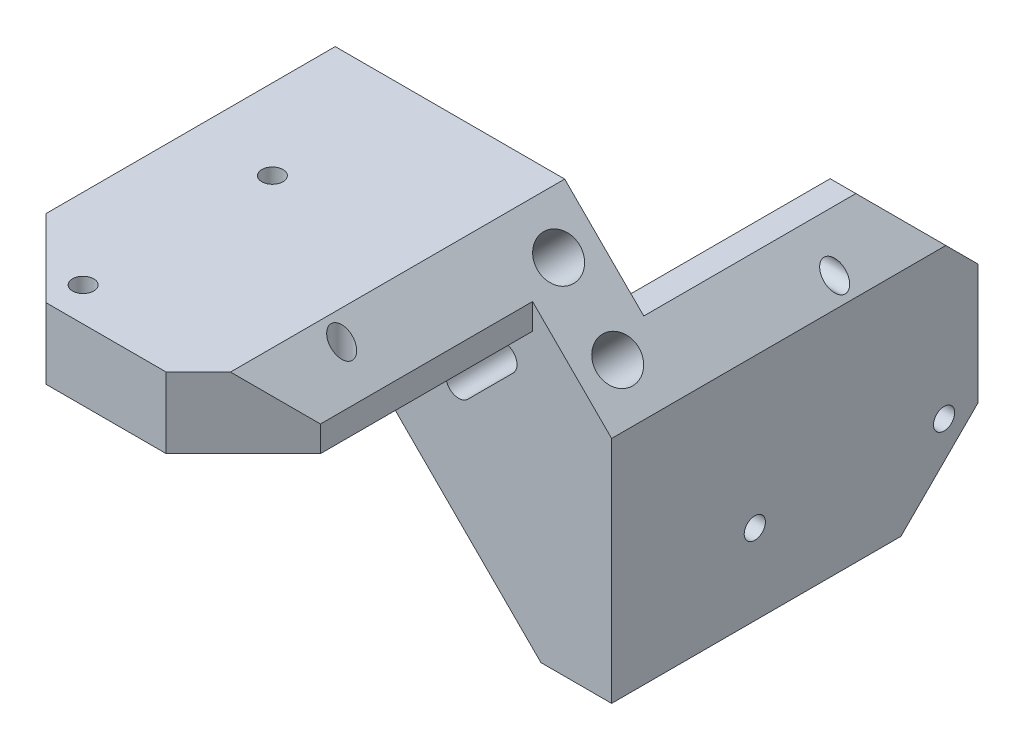
ISO-10303-21;
HEADER;
FILE_DESCRIPTION(('STEP AP214'),'2;1');
FILE_NAME('part.step','',(''),(''),'','','');
FILE_SCHEMA(('AUTOMOTIVE_DESIGN { 1 0 10303 214 1 1 1 1 }'));
ENDSEC;
DATA;
#1=APPLICATION_CONTEXT('core data for automotive mechanical design processes');
#2=APPLICATION_PROTOCOL_DEFINITION('international standard','automotive_design',2000,#1);
#3=PRODUCT_CONTEXT('',#1,'mechanical');
#4=PRODUCT('Part','Part','',(#3));
#5=PRODUCT_RELATED_PRODUCT_CATEGORY('part','',(#4));
#6=PRODUCT_DEFINITION_FORMATION('','',#4);
#7=PRODUCT_DEFINITION_CONTEXT('part definition',#1,'design');
#8=PRODUCT_DEFINITION('design','',#6,#7);
#9=PRODUCT_DEFINITION_SHAPE('','',#8);
#10=(LENGTH_UNIT() NAMED_UNIT(*) SI_UNIT(.MILLI.,.METRE.));
#11=(NAMED_UNIT(*) PLANE_ANGLE_UNIT() SI_UNIT($,.RADIAN.));
#12=(NAMED_UNIT(*) SI_UNIT($,.STERADIAN.) SOLID_ANGLE_UNIT());
#13=UNCERTAINTY_MEASURE_WITH_UNIT(LENGTH_MEASURE(1.E-05),#10,'distance_accuracy_value','');
#14=(GEOMETRIC_REPRESENTATION_CONTEXT(3) GLOBAL_UNCERTAINTY_ASSIGNED_CONTEXT((#13)) GLOBAL_UNIT_ASSIGNED_CONTEXT((#10,
#11,#12)) REPRESENTATION_CONTEXT('',''));
#15=CARTESIAN_POINT('',(0.,0.,0.));
#16=DIRECTION('',(0.,0.,1.));
#17=DIRECTION('',(1.,0.,0.));
#18=AXIS2_PLACEMENT_3D('',#15,#16,#17);
#19=CARTESIAN_POINT('',(27.5,-27.5,51.));
#20=DIRECTION('',(-1.,0.,0.));
#21=DIRECTION('',(0.,0.,1.));
#22=AXIS2_PLACEMENT_3D('',#19,#20,#21);
#23=PLANE('',#22);
#24=CARTESIAN_POINT('',(27.5,-15.0000000000001,-45.7224318643354));
#25=DIRECTION('',(-1.,0.,0.));
#26=DIRECTION('',(0.,0.,1.));
#27=AXIS2_PLACEMENT_3D('',#24,#25,#26);
#28=CIRCLE('',#27,1.65);
#29=CARTESIAN_POINT('',(27.5,-15.0000000000001,-44.0724318643354));
#30=VERTEX_POINT('',#29);
#31=EDGE_CURVE('E283',#30,#30,#28,.T.);
#32=ORIENTED_EDGE('',*,*,#31,.T.);
#33=EDGE_LOOP('',(#32));
#34=FACE_BOUND('',#33,.T.);
#35=CARTESIAN_POINT('',(27.5,-15.0000000000001,-16.2775681356646));
#36=DIRECTION('',(-1.,0.,0.));
#37=DIRECTION('',(0.,0.,1.));
#38=AXIS2_PLACEMENT_3D('',#35,#36,#37);
#39=CIRCLE('',#38,1.65);
#40=CARTESIAN_POINT('',(27.5,-15.0000000000001,-14.6275681356646));
#41=VERTEX_POINT('',#40);
#42=EDGE_CURVE('E289',#41,#41,#39,.T.);
#43=ORIENTED_EDGE('',*,*,#42,.T.);
#44=EDGE_LOOP('',(#43));
#45=FACE_BOUND('',#44,.T.);
#46=DIRECTION('',(0.,0.,-1.));
#47=VECTOR('',#46,1.);
#48=CARTESIAN_POINT('',(27.5,-27.5,51.));
#49=LINE('',#48,#47);
#50=CARTESIAN_POINT('',(27.5,-27.5,6.));
#51=VERTEX_POINT('',#50);
#52=CARTESIAN_POINT('',(27.5,-27.5,-39.));
#53=VERTEX_POINT('',#52);
#54=EDGE_CURVE('E331',#51,#53,#49,.T.);
#55=ORIENTED_EDGE('',*,*,#54,.T.);
#56=DIRECTION('',(0.,0.707106781186548,-0.707106781186547));
#57=VECTOR('',#56,1.);
#58=CARTESIAN_POINT('',(27.5,-27.5,-39.));
#59=LINE('',#58,#57);
#60=CARTESIAN_POINT('',(27.5,-15.5,-51.));
#61=VERTEX_POINT('',#60);
#62=EDGE_CURVE('E353',#53,#61,#59,.T.);
#63=ORIENTED_EDGE('',*,*,#62,.T.);
#64=DIRECTION('',(0.,1.,0.));
#65=VECTOR('',#64,1.);
#66=CARTESIAN_POINT('',(27.5,-27.5,-51.));
#67=LINE('',#66,#65);
#68=CARTESIAN_POINT('',(27.5,3.19999999999998,-51.));
#69=VERTEX_POINT('',#68);
#70=EDGE_CURVE('E325',#61,#69,#67,.T.);
#71=ORIENTED_EDGE('',*,*,#70,.T.);
#72=DIRECTION('',(0.,0.707106781186551,0.707106781186543));
#73=VECTOR('',#72,1.);
#74=CARTESIAN_POINT('',(27.5,3.19999999999998,-51.));
#75=LINE('',#74,#73);
#76=CARTESIAN_POINT('',(27.5,8.19999999999995,-46.0000000000001));
#77=VERTEX_POINT('',#76);
#78=EDGE_CURVE('E198',#69,#77,#75,.T.);
#79=ORIENTED_EDGE('',*,*,#78,.T.);
#80=DIRECTION('',(0.,0.,1.));
#81=VECTOR('',#80,1.);
#82=CARTESIAN_POINT('',(27.5,8.19999999999995,51.));
#83=LINE('',#82,#81);
#84=CARTESIAN_POINT('',(27.5,8.19999999999995,6.));
#85=VERTEX_POINT('',#84);
#86=EDGE_CURVE('E339',#77,#85,#83,.T.);
#87=ORIENTED_EDGE('',*,*,#86,.T.);
#88=DIRECTION('',(0.,1.,0.));
#89=VECTOR('',#88,1.);
#90=CARTESIAN_POINT('',(27.5,-27.5,6.));
#91=LINE('',#90,#89);
#92=EDGE_CURVE('E295',#51,#85,#91,.T.);
#93=ORIENTED_EDGE('',*,*,#92,.F.);
#94=EDGE_LOOP('',(#55,#63,#71,#79,#87,#93));
#95=FACE_BOUND('',#94,.T.);
#96=ADVANCED_FACE('F39',(#34,#45,#95),#23,.F.);
#97=CARTESIAN_POINT('',(-27.5,-27.5,51.));
#98=DIRECTION('',(0.,1.,0.));
#99=DIRECTION('',(0.,0.,1.));
#100=AXIS2_PLACEMENT_3D('',#97,#98,#99);
#101=PLANE('',#100);
#102=DIRECTION('',(0.,0.,1.));
#103=VECTOR('',#102,1.);
#104=CARTESIAN_POINT('',(16.5,-27.5,-51.));
#105=LINE('',#104,#103);
#106=CARTESIAN_POINT('',(16.5,-27.5,-39.));
#107=VERTEX_POINT('',#106);
#108=CARTESIAN_POINT('',(16.5,-27.5,-6.00000000000001));
#109=VERTEX_POINT('',#108);
#110=EDGE_CURVE('E326',#107,#109,#105,.T.);
#111=ORIENTED_EDGE('',*,*,#110,.F.);
#112=DIRECTION('',(1.,0.,0.));
#113=VECTOR('',#112,1.);
#114=CARTESIAN_POINT('',(27.5,-27.5,-39.));
#115=LINE('',#114,#113);
#116=EDGE_CURVE('E346',#107,#53,#115,.T.);
#117=ORIENTED_EDGE('',*,*,#116,.T.);
#118=ORIENTED_EDGE('',*,*,#54,.F.);
#119=DIRECTION('',(1.,0.,0.));
#120=VECTOR('',#119,1.);
#121=CARTESIAN_POINT('',(-27.5,-27.5,6.));
#122=LINE('',#121,#120);
#123=CARTESIAN_POINT('',(16.5,-27.5,6.));
#124=VERTEX_POINT('',#123);
#125=EDGE_CURVE('E293',#124,#51,#122,.T.);
#126=ORIENTED_EDGE('',*,*,#125,.F.);
#127=EDGE_CURVE('E321',#109,#124,#105,.T.);
#128=ORIENTED_EDGE('',*,*,#127,.F.);
#129=EDGE_LOOP('',(#111,#117,#118,#126,#128));
#130=FACE_BOUND('',#129,.T.);
#131=ADVANCED_FACE('F391',(#130),#101,.F.);
#132=CARTESIAN_POINT('',(0.,0.,51.));
#133=DIRECTION('',(0.,0.,-1.));
#134=DIRECTION('',(-1.,0.,0.));
#135=AXIS2_PLACEMENT_3D('',#132,#133,#134);
#136=PLANE('',#135);
#137=DIRECTION('',(-1.,0.,0.));
#138=VECTOR('',#137,1.);
#139=CARTESIAN_POINT('',(-27.5,27.5,51.));
#140=LINE('',#139,#138);
#141=CARTESIAN_POINT('',(3.19999999999997,27.5,51.));
#142=VERTEX_POINT('',#141);
#143=CARTESIAN_POINT('',(-15.5,27.5,51.));
#144=VERTEX_POINT('',#143);
#145=EDGE_CURVE('E328',#142,#144,#140,.T.);
#146=ORIENTED_EDGE('',*,*,#145,.T.);
#147=DIRECTION('',(0.,-1.,0.));
#148=VECTOR('',#147,1.);
#149=CARTESIAN_POINT('',(-15.5,0.,51.));
#150=LINE('',#149,#148);
#151=CARTESIAN_POINT('',(-15.5,16.5,51.));
#152=VERTEX_POINT('',#151);
#153=EDGE_CURVE('E359',#144,#152,#150,.T.);
#154=ORIENTED_EDGE('',*,*,#153,.T.);
#155=DIRECTION('',(-1.,0.,0.));
#156=VECTOR('',#155,1.);
#157=CARTESIAN_POINT('',(-27.5,16.5,51.));
#158=LINE('',#157,#156);
#159=CARTESIAN_POINT('',(3.19999999999997,16.5,51.));
#160=VERTEX_POINT('',#159);
#161=EDGE_CURVE('E296',#160,#152,#158,.T.);
#162=ORIENTED_EDGE('',*,*,#161,.F.);
#163=DIRECTION('',(0.,-1.,0.));
#164=VECTOR('',#163,1.);
#165=CARTESIAN_POINT('',(3.19999999999997,27.5,51.));
#166=LINE('',#165,#164);
#167=EDGE_CURVE('E229',#142,#160,#166,.T.);
#168=ORIENTED_EDGE('',*,*,#167,.F.);
#169=EDGE_LOOP('',(#146,#154,#162,#168));
#170=FACE_BOUND('',#169,.T.);
#171=ADVANCED_FACE('F397',(#170),#136,.F.);
#172=CARTESIAN_POINT('',(-27.5,16.5,-51.));
#173=DIRECTION('',(0.707106781186548,0.707106781186548,0.));
#174=DIRECTION('',(-0.707106781186548,0.707106781186548,0.));
#175=AXIS2_PLACEMENT_3D('',#172,#173,#174);
#176=PLANE('',#175);
#177=CARTESIAN_POINT('',(-10.0961940777126,-0.903805922287441,0.));
#178=DIRECTION('',(-0.707106781186548,-0.707106781186547,0.));
#179=DIRECTION('',(0.707106781186547,-0.707106781186548,0.));
#180=AXIS2_PLACEMENT_3D('',#177,#178,#179);
#181=CIRCLE('',#180,5.49999999999999);
#182=CARTESIAN_POINT('',(-6.20710678118655,-4.79289321881345,0.));
#183=VERTEX_POINT('',#182);
#184=EDGE_CURVE('E236',#183,#183,#181,.T.);
#185=ORIENTED_EDGE('',*,*,#184,.F.);
#186=EDGE_LOOP('',(#185));
#187=FACE_BOUND('',#186,.T.);
#188=CARTESIAN_POINT('',(-0.903805922287443,-10.0961940777126,0.));
#189=DIRECTION('',(-0.707106781186548,-0.707106781186547,0.));
#190=DIRECTION('',(0.707106781186547,-0.707106781186548,0.));
#191=AXIS2_PLACEMENT_3D('',#188,#189,#190);
#192=CIRCLE('',#191,5.49999999999999);
#193=CARTESIAN_POINT('',(2.98528137423856,-13.9852813742386,0.));
#194=VERTEX_POINT('',#193);
#195=EDGE_CURVE('E246',#194,#194,#192,.T.);
#196=ORIENTED_EDGE('',*,*,#195,.F.);
#197=EDGE_LOOP('',(#196));
#198=FACE_BOUND('',#197,.T.);
#199=DIRECTION('',(0.707106781186548,-0.707106781186548,0.));
#200=VECTOR('',#199,1.);
#201=CARTESIAN_POINT('',(-27.5,16.5,6.));
#202=LINE('',#201,#200);
#203=CARTESIAN_POINT('',(-27.5,16.5,6.));
#204=VERTEX_POINT('',#203);
#205=EDGE_CURVE('E305',#204,#124,#202,.T.);
#206=ORIENTED_EDGE('',*,*,#205,.F.);
#207=DIRECTION('',(0.,0.,1.));
#208=VECTOR('',#207,1.);
#209=CARTESIAN_POINT('',(-27.5,16.5,-51.));
#210=LINE('',#209,#208);
#211=CARTESIAN_POINT('',(-27.5,16.5,-6.));
#212=VERTEX_POINT('',#211);
#213=EDGE_CURVE('E322',#212,#204,#210,.T.);
#214=ORIENTED_EDGE('',*,*,#213,.F.);
#215=DIRECTION('',(0.707106781186548,-0.707106781186548,0.));
#216=VECTOR('',#215,1.);
#217=CARTESIAN_POINT('',(-27.5,16.5,-6.));
#218=LINE('',#217,#216);
#219=EDGE_CURVE('E318',#212,#109,#218,.T.);
#220=ORIENTED_EDGE('',*,*,#219,.T.);
#221=ORIENTED_EDGE('',*,*,#127,.T.);
#222=EDGE_LOOP('',(#206,#214,#220,#221));
#223=FACE_BOUND('',#222,.T.);
#224=ADVANCED_FACE('F407',(#187,#198,#223),#176,.F.);
#225=CARTESIAN_POINT('',(8.20000000000001,27.5,51.));
#226=DIRECTION('',(-0.707106781186548,-0.707106781186546,0.));
#227=DIRECTION('',(0.,0.,-1.));
#228=AXIS2_PLACEMENT_3D('',#225,#226,#227);
#229=PLANE('',#228);
#230=DIRECTION('',(0.,0.,1.));
#231=VECTOR('',#230,1.);
#232=CARTESIAN_POINT('',(20.5,15.2,51.));
#233=LINE('',#232,#231);
#234=CARTESIAN_POINT('',(20.5,15.2,-6.));
#235=VERTEX_POINT('',#234);
#236=CARTESIAN_POINT('',(20.5,15.2,-39.0000000000001));
#237=VERTEX_POINT('',#236);
#238=EDGE_CURVE('E215',#235,#237,#233,.F.);
#239=ORIENTED_EDGE('',*,*,#238,.F.);
#240=DIRECTION('',(-0.707106781186547,0.707106781186549,0.));
#241=VECTOR('',#240,1.);
#242=CARTESIAN_POINT('',(8.2,27.5,-6.));
#243=LINE('',#242,#241);
#244=CARTESIAN_POINT('',(8.2,27.5,-6.));
#245=VERTEX_POINT('',#244);
#246=EDGE_CURVE('E341',#245,#235,#243,.F.);
#247=ORIENTED_EDGE('',*,*,#246,.F.);
#248=DIRECTION('',(0.,0.,-1.));
#249=VECTOR('',#248,1.);
#250=CARTESIAN_POINT('',(8.20000000000001,27.5,51.));
#251=LINE('',#250,#249);
#252=CARTESIAN_POINT('',(8.2,27.5,46.));
#253=VERTEX_POINT('',#252);
#254=EDGE_CURVE('E337',#253,#245,#251,.T.);
#255=ORIENTED_EDGE('',*,*,#254,.F.);
#256=DIRECTION('',(0.577350269189625,-0.577350269189626,-0.577350269189627));
#257=VECTOR('',#256,1.);
#258=CARTESIAN_POINT('',(6.53333333333332,29.1666666666667,47.6666666666666));
#259=LINE('',#258,#257);
#260=CARTESIAN_POINT('',(15.2,20.5,39.));
#261=VERTEX_POINT('',#260);
#262=EDGE_CURVE('E228',#261,#253,#259,.F.);
#263=ORIENTED_EDGE('',*,*,#262,.F.);
#264=DIRECTION('',(0.,0.,-1.));
#265=VECTOR('',#264,1.);
#266=CARTESIAN_POINT('',(15.2,20.5,51.));
#267=LINE('',#266,#265);
#268=CARTESIAN_POINT('',(15.2,20.5,6.));
#269=VERTEX_POINT('',#268);
#270=EDGE_CURVE('E234',#269,#261,#267,.F.);
#271=ORIENTED_EDGE('',*,*,#270,.F.);
#272=DIRECTION('',(-0.707106781186547,0.707106781186549,0.));
#273=VECTOR('',#272,1.);
#274=CARTESIAN_POINT('',(8.20000000000001,27.5,6.));
#275=LINE('',#274,#273);
#276=EDGE_CURVE('E343',#269,#85,#275,.F.);
#277=ORIENTED_EDGE('',*,*,#276,.T.);
#278=ORIENTED_EDGE('',*,*,#86,.F.);
#279=DIRECTION('',(-0.577350269189627,0.577350269189628,0.577350269189622));
#280=VECTOR('',#279,1.);
#281=CARTESIAN_POINT('',(-17.7,53.4,-0.800000000000495));
#282=LINE('',#281,#280);
#283=EDGE_CURVE('E209',#237,#77,#282,.F.);
#284=ORIENTED_EDGE('',*,*,#283,.F.);
#285=EDGE_LOOP('',(#239,#247,#255,#263,#271,#277,#278,#284));
#286=FACE_BOUND('',#285,.T.);
#287=CARTESIAN_POINT('',(13.2538059222874,22.4461940777126,0.));
#288=DIRECTION('',(-0.707106781186548,-0.707106781186546,0.));
#289=DIRECTION('',(0.707106781186547,-0.707106781186549,0.));
#290=AXIS2_PLACEMENT_3D('',#287,#288,#289);
#291=CIRCLE('',#290,3.29999999999999);
#292=CARTESIAN_POINT('',(15.587258300203,20.1127416997969,0.));
#293=VERTEX_POINT('',#292);
#294=EDGE_CURVE('E245',#293,#293,#291,.F.);
#295=ORIENTED_EDGE('',*,*,#294,.F.);
#296=EDGE_LOOP('',(#295));
#297=FACE_BOUND('',#296,.T.);
#298=CARTESIAN_POINT('',(22.4461940777125,13.2538059222874,0.));
#299=DIRECTION('',(-0.707106781186548,-0.707106781186546,0.));
#300=DIRECTION('',(0.707106781186547,-0.707106781186549,0.));
#301=AXIS2_PLACEMENT_3D('',#298,#299,#300);
#302=CIRCLE('',#301,3.29999999999999);
#303=CARTESIAN_POINT('',(24.7796464556281,10.9203535443718,0.));
#304=VERTEX_POINT('',#303);
#305=EDGE_CURVE('E255',#304,#304,#302,.F.);
#306=ORIENTED_EDGE('',*,*,#305,.F.);
#307=EDGE_LOOP('',(#306));
#308=FACE_BOUND('',#307,.T.);
#309=CARTESIAN_POINT('',(10.5,25.2,31.));
#310=DIRECTION('',(-0.707106781186548,-0.707106781186546,0.));
#311=DIRECTION('',(0.707106781186547,-0.707106781186549,0.));
#312=AXIS2_PLACEMENT_3D('',#309,#310,#311);
#313=ELLIPSE('',#312,2.3334523779156,1.64999999999999);
#314=CARTESIAN_POINT('',(12.15,23.55,31.));
#315=VERTEX_POINT('',#314);
#316=EDGE_CURVE('E259',#315,#315,#313,.F.);
#317=ORIENTED_EDGE('',*,*,#316,.F.);
#318=EDGE_LOOP('',(#317));
#319=FACE_BOUND('',#318,.T.);
#320=CARTESIAN_POINT('',(25.2,10.5,-31.));
#321=DIRECTION('',(-0.707106781186548,-0.707106781186546,0.));
#322=DIRECTION('',(-0.707106781186547,0.707106781186549,0.));
#323=AXIS2_PLACEMENT_3D('',#320,#321,#322);
#324=ELLIPSE('',#323,2.33345237791559,1.64999999999999);
#325=CARTESIAN_POINT('',(23.55,12.15,-31.));
#326=VERTEX_POINT('',#325);
#327=EDGE_CURVE('E277',#326,#326,#324,.F.);
#328=ORIENTED_EDGE('',*,*,#327,.F.);
#329=EDGE_LOOP('',(#328));
#330=FACE_BOUND('',#329,.T.);
#331=ADVANCED_FACE('F405',(#286,#297,#308,#319,#330),#229,.F.);
#332=CARTESIAN_POINT('',(-27.5,27.5,51.));
#333=DIRECTION('',(0.,-1.,0.));
#334=DIRECTION('',(0.,0.,-1.));
#335=AXIS2_PLACEMENT_3D('',#332,#333,#334);
#336=PLANE('',#335);
#337=CARTESIAN_POINT('',(-15.0000000000001,27.5,45.7224318643354));
#338=DIRECTION('',(0.,-1.,0.));
#339=DIRECTION('',(0.,0.,-1.));
#340=AXIS2_PLACEMENT_3D('',#337,#338,#339);
#341=CIRCLE('',#340,1.65);
#342=CARTESIAN_POINT('',(-15.0000000000001,27.5,44.0724318643354));
#343=VERTEX_POINT('',#342);
#344=EDGE_CURVE('E265',#343,#343,#341,.T.);
#345=ORIENTED_EDGE('',*,*,#344,.T.);
#346=EDGE_LOOP('',(#345));
#347=FACE_BOUND('',#346,.T.);
#348=CARTESIAN_POINT('',(-15.0000000000001,27.5,16.2775681356646));
#349=DIRECTION('',(0.,-1.,0.));
#350=DIRECTION('',(0.,0.,-1.));
#351=AXIS2_PLACEMENT_3D('',#348,#349,#350);
#352=CIRCLE('',#351,1.65);
#353=CARTESIAN_POINT('',(-15.0000000000001,27.5,14.6275681356646));
#354=VERTEX_POINT('',#353);
#355=EDGE_CURVE('E271',#354,#354,#352,.T.);
#356=ORIENTED_EDGE('',*,*,#355,.T.);
#357=EDGE_LOOP('',(#356));
#358=FACE_BOUND('',#357,.T.);
#359=DIRECTION('',(0.,0.,-1.));
#360=VECTOR('',#359,1.);
#361=CARTESIAN_POINT('',(-27.5,27.5,51.));
#362=LINE('',#361,#360);
#363=CARTESIAN_POINT('',(-27.5,27.5,39.));
#364=VERTEX_POINT('',#363);
#365=CARTESIAN_POINT('',(-27.5,27.5,-6.));
#366=VERTEX_POINT('',#365);
#367=EDGE_CURVE('E335',#364,#366,#362,.T.);
#368=ORIENTED_EDGE('',*,*,#367,.F.);
#369=DIRECTION('',(-0.707106781186546,0.,-0.707106781186549));
#370=VECTOR('',#369,1.);
#371=CARTESIAN_POINT('',(-15.5,27.5,51.));
#372=LINE('',#371,#370);
#373=EDGE_CURVE('E366',#364,#144,#372,.F.);
#374=ORIENTED_EDGE('',*,*,#373,.T.);
#375=ORIENTED_EDGE('',*,*,#145,.F.);
#376=DIRECTION('',(0.707106781186546,0.,-0.707106781186549));
#377=VECTOR('',#376,1.);
#378=CARTESIAN_POINT('',(3.19999999999997,27.5,51.));
#379=LINE('',#378,#377);
#380=EDGE_CURVE('E218',#142,#253,#379,.T.);
#381=ORIENTED_EDGE('',*,*,#380,.T.);
#382=ORIENTED_EDGE('',*,*,#254,.T.);
#383=DIRECTION('',(1.,0.,0.));
#384=VECTOR('',#383,1.);
#385=CARTESIAN_POINT('',(-27.5,27.5,-6.));
#386=LINE('',#385,#384);
#387=EDGE_CURVE('E311',#366,#245,#386,.T.);
#388=ORIENTED_EDGE('',*,*,#387,.F.);
#389=EDGE_LOOP('',(#368,#374,#375,#381,#382,#388));
#390=FACE_BOUND('',#389,.T.);
#391=ADVANCED_FACE('F403',(#347,#358,#390),#336,.F.);
#392=CARTESIAN_POINT('',(-27.5,-27.5,51.));
#393=DIRECTION('',(1.,0.,0.));
#394=DIRECTION('',(0.,0.,-1.));
#395=AXIS2_PLACEMENT_3D('',#392,#393,#394);
#396=PLANE('',#395);
#397=DIRECTION('',(0.,0.,-1.));
#398=VECTOR('',#397,1.);
#399=CARTESIAN_POINT('',(-27.5,16.5,51.));
#400=LINE('',#399,#398);
#401=CARTESIAN_POINT('',(-27.5,16.5,39.));
#402=VERTEX_POINT('',#401);
#403=EDGE_CURVE('E292',#402,#204,#400,.T.);
#404=ORIENTED_EDGE('',*,*,#403,.F.);
#405=DIRECTION('',(0.,1.,0.));
#406=VECTOR('',#405,1.);
#407=CARTESIAN_POINT('',(-27.5,-27.5,39.));
#408=LINE('',#407,#406);
#409=EDGE_CURVE('E364',#402,#364,#408,.T.);
#410=ORIENTED_EDGE('',*,*,#409,.T.);
#411=ORIENTED_EDGE('',*,*,#367,.T.);
#412=DIRECTION('',(0.,-1.,0.));
#413=VECTOR('',#412,1.);
#414=CARTESIAN_POINT('',(-27.5,27.5,-6.));
#415=LINE('',#414,#413);
#416=EDGE_CURVE('E308',#366,#212,#415,.T.);
#417=ORIENTED_EDGE('',*,*,#416,.T.);
#418=ORIENTED_EDGE('',*,*,#213,.T.);
#419=EDGE_LOOP('',(#404,#410,#411,#417,#418));
#420=FACE_BOUND('',#419,.T.);
#421=ADVANCED_FACE('F438',(#420),#396,.F.);
#422=CARTESIAN_POINT('',(0.,0.,-51.));
#423=DIRECTION('',(0.,0.,-1.));
#424=DIRECTION('',(-1.,0.,0.));
#425=AXIS2_PLACEMENT_3D('',#422,#423,#424);
#426=PLANE('',#425);
#427=ORIENTED_EDGE('',*,*,#70,.F.);
#428=DIRECTION('',(-1.,0.,0.));
#429=VECTOR('',#428,1.);
#430=CARTESIAN_POINT('',(16.5,-15.5,-51.));
#431=LINE('',#430,#429);
#432=CARTESIAN_POINT('',(16.5,-15.5,-51.));
#433=VERTEX_POINT('',#432);
#434=EDGE_CURVE('E355',#61,#433,#431,.T.);
#435=ORIENTED_EDGE('',*,*,#434,.T.);
#436=DIRECTION('',(0.,1.,0.));
#437=VECTOR('',#436,1.);
#438=CARTESIAN_POINT('',(16.5,27.5,-51.));
#439=LINE('',#438,#437);
#440=CARTESIAN_POINT('',(16.5,3.19999999999998,-51.));
#441=VERTEX_POINT('',#440);
#442=EDGE_CURVE('E312',#433,#441,#439,.T.);
#443=ORIENTED_EDGE('',*,*,#442,.T.);
#444=DIRECTION('',(-1.,0.,0.));
#445=VECTOR('',#444,1.);
#446=CARTESIAN_POINT('',(27.5,3.19999999999998,-51.));
#447=LINE('',#446,#445);
#448=EDGE_CURVE('E201',#69,#441,#447,.T.);
#449=ORIENTED_EDGE('',*,*,#448,.F.);
#450=EDGE_LOOP('',(#427,#435,#443,#449));
#451=FACE_BOUND('',#450,.T.);
#452=ADVANCED_FACE('F471',(#451),#426,.T.);
#453=CARTESIAN_POINT('',(-27.5,27.5,-6.));
#454=DIRECTION('',(0.,0.,1.));
#455=DIRECTION('',(0.,-1.,0.));
#456=AXIS2_PLACEMENT_3D('',#453,#454,#455);
#457=PLANE('',#456);
#458=DIRECTION('',(0.707106781186547,0.707106781186548,0.));
#459=VECTOR('',#458,1.);
#460=CARTESIAN_POINT('',(2.29365081389596,5.12207793864214,-6.));
#461=LINE('',#460,#459);
#462=CARTESIAN_POINT('',(2.29365081389596,5.12207793864215,-6.));
#463=VERTEX_POINT('',#462);
#464=CARTESIAN_POINT('',(9.36471862576143,12.1931457505076,-6.));
#465=VERTEX_POINT('',#464);
#466=EDGE_CURVE('E181',#463,#465,#461,.T.);
#467=ORIENTED_EDGE('',*,*,#466,.F.);
#468=CARTESIAN_POINT('',(3.70786437626905,3.70786437626905,-6.));
#469=DIRECTION('',(0.,0.,-1.));
#470=DIRECTION('',(0.,1.,0.));
#471=AXIS2_PLACEMENT_3D('',#468,#469,#470);
#472=CIRCLE('',#471,2.);
#473=CARTESIAN_POINT('',(5.12207793864215,2.29365081389595,-6.));
#474=VERTEX_POINT('',#473);
#475=EDGE_CURVE('E54',#474,#463,#472,.T.);
#476=ORIENTED_EDGE('',*,*,#475,.F.);
#477=DIRECTION('',(-0.707106781186548,-0.707106781186547,0.));
#478=VECTOR('',#477,1.);
#479=CARTESIAN_POINT('',(5.12207793864215,2.29365081389595,-6.));
#480=LINE('',#479,#478);
#481=CARTESIAN_POINT('',(12.1931457505076,9.36471862576143,-6.));
#482=VERTEX_POINT('',#481);
#483=EDGE_CURVE('E188',#482,#474,#480,.T.);
#484=ORIENTED_EDGE('',*,*,#483,.F.);
#485=CARTESIAN_POINT('',(10.7789321881345,10.7789321881345,-6.));
#486=DIRECTION('',(0.,0.,-1.));
#487=DIRECTION('',(0.,1.,0.));
#488=AXIS2_PLACEMENT_3D('',#485,#486,#487);
#489=CIRCLE('',#488,2.);
#490=EDGE_CURVE('E172',#465,#482,#489,.T.);
#491=ORIENTED_EDGE('',*,*,#490,.F.);
#492=EDGE_LOOP('',(#467,#476,#484,#491));
#493=FACE_BOUND('',#492,.T.);
#494=ORIENTED_EDGE('',*,*,#416,.F.);
#495=ORIENTED_EDGE('',*,*,#387,.T.);
#496=ORIENTED_EDGE('',*,*,#246,.T.);
#497=DIRECTION('',(-1.,0.,0.));
#498=VECTOR('',#497,1.);
#499=CARTESIAN_POINT('',(27.5,15.2,-6.));
#500=LINE('',#499,#498);
#501=CARTESIAN_POINT('',(16.5,15.2,-6.));
#502=VERTEX_POINT('',#501);
#503=EDGE_CURVE('E207',#235,#502,#500,.T.);
#504=ORIENTED_EDGE('',*,*,#503,.T.);
#505=DIRECTION('',(0.,-1.,0.));
#506=VECTOR('',#505,1.);
#507=CARTESIAN_POINT('',(16.5,27.5,-6.));
#508=LINE('',#507,#506);
#509=EDGE_CURVE('E307',#502,#109,#508,.T.);
#510=ORIENTED_EDGE('',*,*,#509,.T.);
#511=ORIENTED_EDGE('',*,*,#219,.F.);
#512=EDGE_LOOP('',(#494,#495,#496,#504,#510,#511));
#513=FACE_BOUND('',#512,.T.);
#514=ADVANCED_FACE('F185',(#493,#513),#457,.F.);
#515=CARTESIAN_POINT('',(16.5,0.,0.));
#516=DIRECTION('',(1.,0.,0.));
#517=DIRECTION('',(0.,0.,-1.));
#518=AXIS2_PLACEMENT_3D('',#515,#516,#517);
#519=PLANE('',#518);
#520=CARTESIAN_POINT('',(16.5,10.5,-31.));
#521=DIRECTION('',(-1.,0.,0.));
#522=DIRECTION('',(0.,0.,1.));
#523=AXIS2_PLACEMENT_3D('',#520,#521,#522);
#524=CIRCLE('',#523,1.64999999999999);
#525=CARTESIAN_POINT('',(16.5,10.5,-29.35));
#526=VERTEX_POINT('',#525);
#527=EDGE_CURVE('E274',#526,#526,#524,.T.);
#528=ORIENTED_EDGE('',*,*,#527,.F.);
#529=EDGE_LOOP('',(#528));
#530=FACE_BOUND('',#529,.T.);
#531=CARTESIAN_POINT('',(16.5,-15.0000000000001,-45.7224318643354));
#532=DIRECTION('',(-1.,0.,0.));
#533=DIRECTION('',(0.,0.,1.));
#534=AXIS2_PLACEMENT_3D('',#531,#532,#533);
#535=CIRCLE('',#534,1.64999999999999);
#536=CARTESIAN_POINT('',(16.5,-15.0000000000001,-44.0724318643354));
#537=VERTEX_POINT('',#536);
#538=EDGE_CURVE('E280',#537,#537,#535,.T.);
#539=ORIENTED_EDGE('',*,*,#538,.F.);
#540=EDGE_LOOP('',(#539));
#541=FACE_BOUND('',#540,.T.);
#542=CARTESIAN_POINT('',(16.5,-15.0000000000001,-16.2775681356646));
#543=DIRECTION('',(-1.,0.,0.));
#544=DIRECTION('',(0.,0.,1.));
#545=AXIS2_PLACEMENT_3D('',#542,#543,#544);
#546=CIRCLE('',#545,1.64999999999999);
#547=CARTESIAN_POINT('',(16.5,-15.0000000000001,-14.6275681356646));
#548=VERTEX_POINT('',#547);
#549=EDGE_CURVE('E286',#548,#548,#546,.T.);
#550=ORIENTED_EDGE('',*,*,#549,.F.);
#551=EDGE_LOOP('',(#550));
#552=FACE_BOUND('',#551,.T.);
#553=ORIENTED_EDGE('',*,*,#442,.F.);
#554=DIRECTION('',(0.,-0.707106781186548,0.707106781186547));
#555=VECTOR('',#554,1.);
#556=CARTESIAN_POINT('',(16.5,-27.5,-39.));
#557=LINE('',#556,#555);
#558=EDGE_CURVE('E357',#433,#107,#557,.T.);
#559=ORIENTED_EDGE('',*,*,#558,.T.);
#560=ORIENTED_EDGE('',*,*,#110,.T.);
#561=ORIENTED_EDGE('',*,*,#509,.F.);
#562=DIRECTION('',(0.,0.,1.));
#563=VECTOR('',#562,1.);
#564=CARTESIAN_POINT('',(16.5,15.2,-39.0000000000001));
#565=LINE('',#564,#563);
#566=CARTESIAN_POINT('',(16.5,15.2,-39.0000000000001));
#567=VERTEX_POINT('',#566);
#568=EDGE_CURVE('E202',#567,#502,#565,.T.);
#569=ORIENTED_EDGE('',*,*,#568,.F.);
#570=DIRECTION('',(0.,0.707106781186551,0.707106781186543));
#571=VECTOR('',#570,1.);
#572=CARTESIAN_POINT('',(16.5,3.19999999999998,-51.));
#573=LINE('',#572,#571);
#574=EDGE_CURVE('E195',#441,#567,#573,.T.);
#575=ORIENTED_EDGE('',*,*,#574,.F.);
#576=EDGE_LOOP('',(#553,#559,#560,#561,#569,#575));
#577=FACE_BOUND('',#576,.T.);
#578=ADVANCED_FACE('F424',(#530,#541,#552,#577),#519,.F.);
#579=CARTESIAN_POINT('',(-27.5,-27.5,6.));
#580=DIRECTION('',(0.,0.,1.));
#581=DIRECTION('',(1.,0.,0.));
#582=AXIS2_PLACEMENT_3D('',#579,#580,#581);
#583=PLANE('',#582);
#584=CARTESIAN_POINT('',(3.70786437626905,3.70786437626905,6.));
#585=DIRECTION('',(0.,0.,1.));
#586=DIRECTION('',(1.,0.,0.));
#587=AXIS2_PLACEMENT_3D('',#584,#585,#586);
#588=CIRCLE('',#587,2.);
#589=CARTESIAN_POINT('',(2.29365081389596,5.12207793864214,6.));
#590=VERTEX_POINT('',#589);
#591=CARTESIAN_POINT('',(5.12207793864215,2.29365081389595,6.));
#592=VERTEX_POINT('',#591);
#593=EDGE_CURVE('E11',#590,#592,#588,.T.);
#594=ORIENTED_EDGE('',*,*,#593,.F.);
#595=DIRECTION('',(-0.707106781186547,-0.707106781186548,0.));
#596=VECTOR('',#595,1.);
#597=CARTESIAN_POINT('',(-28.9142135623731,-26.0857864376269,6.));
#598=LINE('',#597,#596);
#599=CARTESIAN_POINT('',(9.36471862576143,12.1931457505076,6.));
#600=VERTEX_POINT('',#599);
#601=EDGE_CURVE('E368',#600,#590,#598,.T.);
#602=ORIENTED_EDGE('',*,*,#601,.F.);
#603=CARTESIAN_POINT('',(10.7789321881345,10.7789321881345,6.));
#604=DIRECTION('',(0.,0.,1.));
#605=DIRECTION('',(1.,0.,0.));
#606=AXIS2_PLACEMENT_3D('',#603,#604,#605);
#607=CIRCLE('',#606,2.);
#608=CARTESIAN_POINT('',(12.1931457505076,9.36471862576143,6.));
#609=VERTEX_POINT('',#608);
#610=EDGE_CURVE('E175',#609,#600,#607,.T.);
#611=ORIENTED_EDGE('',*,*,#610,.F.);
#612=DIRECTION('',(0.707106781186548,0.707106781186547,0.));
#613=VECTOR('',#612,1.);
#614=CARTESIAN_POINT('',(-26.0857864376269,-28.9142135623731,6.));
#615=LINE('',#614,#613);
#616=EDGE_CURVE('E47',#592,#609,#615,.T.);
#617=ORIENTED_EDGE('',*,*,#616,.F.);
#618=EDGE_LOOP('',(#594,#602,#611,#617));
#619=FACE_BOUND('',#618,.T.);
#620=ORIENTED_EDGE('',*,*,#205,.T.);
#621=ORIENTED_EDGE('',*,*,#125,.T.);
#622=ORIENTED_EDGE('',*,*,#92,.T.);
#623=ORIENTED_EDGE('',*,*,#276,.F.);
#624=DIRECTION('',(0.,-1.,0.));
#625=VECTOR('',#624,1.);
#626=CARTESIAN_POINT('',(15.2,27.5,6.));
#627=LINE('',#626,#625);
#628=CARTESIAN_POINT('',(15.2,16.5,6.));
#629=VERTEX_POINT('',#628);
#630=EDGE_CURVE('E221',#269,#629,#627,.T.);
#631=ORIENTED_EDGE('',*,*,#630,.T.);
#632=DIRECTION('',(1.,0.,0.));
#633=VECTOR('',#632,1.);
#634=CARTESIAN_POINT('',(-27.5,16.5,6.));
#635=LINE('',#634,#633);
#636=EDGE_CURVE('E298',#204,#629,#635,.T.);
#637=ORIENTED_EDGE('',*,*,#636,.F.);
#638=EDGE_LOOP('',(#620,#621,#622,#623,#631,#637));
#639=FACE_BOUND('',#638,.T.);
#640=ADVANCED_FACE('F376',(#619,#639),#583,.T.);
#641=CARTESIAN_POINT('',(0.,16.5,0.));
#642=DIRECTION('',(0.,-1.,0.));
#643=DIRECTION('',(0.,0.,-1.));
#644=AXIS2_PLACEMENT_3D('',#641,#642,#643);
#645=PLANE('',#644);
#646=ORIENTED_EDGE('',*,*,#161,.T.);
#647=DIRECTION('',(0.707106781186546,0.,0.707106781186549));
#648=VECTOR('',#647,1.);
#649=CARTESIAN_POINT('',(-33.25,16.5,33.2499999999999));
#650=LINE('',#649,#648);
#651=EDGE_CURVE('E362',#152,#402,#650,.F.);
#652=ORIENTED_EDGE('',*,*,#651,.T.);
#653=ORIENTED_EDGE('',*,*,#403,.T.);
#654=ORIENTED_EDGE('',*,*,#636,.T.);
#655=DIRECTION('',(0.,0.,-1.));
#656=VECTOR('',#655,1.);
#657=CARTESIAN_POINT('',(15.2,16.5,39.));
#658=LINE('',#657,#656);
#659=CARTESIAN_POINT('',(15.2,16.5,39.));
#660=VERTEX_POINT('',#659);
#661=EDGE_CURVE('E217',#660,#629,#658,.T.);
#662=ORIENTED_EDGE('',*,*,#661,.F.);
#663=DIRECTION('',(0.707106781186546,0.,-0.707106781186549));
#664=VECTOR('',#663,1.);
#665=CARTESIAN_POINT('',(3.19999999999997,16.5,51.));
#666=LINE('',#665,#664);
#667=EDGE_CURVE('E222',#160,#660,#666,.T.);
#668=ORIENTED_EDGE('',*,*,#667,.F.);
#669=EDGE_LOOP('',(#646,#652,#653,#654,#662,#668));
#670=FACE_BOUND('',#669,.T.);
#671=CARTESIAN_POINT('',(10.5,16.5,31.));
#672=DIRECTION('',(0.,-1.,0.));
#673=DIRECTION('',(0.,0.,-1.));
#674=AXIS2_PLACEMENT_3D('',#671,#672,#673);
#675=CIRCLE('',#674,1.64999999999999);
#676=CARTESIAN_POINT('',(10.5,16.5,29.35));
#677=VERTEX_POINT('',#676);
#678=EDGE_CURVE('E256',#677,#677,#675,.T.);
#679=ORIENTED_EDGE('',*,*,#678,.F.);
#680=EDGE_LOOP('',(#679));
#681=FACE_BOUND('',#680,.T.);
#682=CARTESIAN_POINT('',(-15.0000000000001,16.5,45.7224318643354));
#683=DIRECTION('',(0.,-1.,0.));
#684=DIRECTION('',(0.,0.,-1.));
#685=AXIS2_PLACEMENT_3D('',#682,#683,#684);
#686=CIRCLE('',#685,1.64999999999999);
#687=CARTESIAN_POINT('',(-15.0000000000001,16.5,44.0724318643354));
#688=VERTEX_POINT('',#687);
#689=EDGE_CURVE('E262',#688,#688,#686,.T.);
#690=ORIENTED_EDGE('',*,*,#689,.F.);
#691=EDGE_LOOP('',(#690));
#692=FACE_BOUND('',#691,.T.);
#693=CARTESIAN_POINT('',(-15.0000000000001,16.5,16.2775681356646));
#694=DIRECTION('',(0.,-1.,0.));
#695=DIRECTION('',(0.,0.,-1.));
#696=AXIS2_PLACEMENT_3D('',#693,#694,#695);
#697=CIRCLE('',#696,1.64999999999999);
#698=CARTESIAN_POINT('',(-15.0000000000001,16.5,14.6275681356646));
#699=VERTEX_POINT('',#698);
#700=EDGE_CURVE('E268',#699,#699,#697,.T.);
#701=ORIENTED_EDGE('',*,*,#700,.F.);
#702=EDGE_LOOP('',(#701));
#703=FACE_BOUND('',#702,.T.);
#704=ADVANCED_FACE('F450',(#670,#681,#692,#703),#645,.T.);
#705=CARTESIAN_POINT('',(16.5,-15.0000000000001,-16.2775681356646));
#706=DIRECTION('',(-1.,0.,0.));
#707=DIRECTION('',(0.,0.,1.));
#708=AXIS2_PLACEMENT_3D('',#705,#706,#707);
#709=CYLINDRICAL_SURFACE('',#708,1.64999999999999);
#710=ORIENTED_EDGE('',*,*,#42,.F.);
#711=EDGE_LOOP('',(#710));
#712=FACE_BOUND('',#711,.T.);
#713=ORIENTED_EDGE('',*,*,#549,.T.);
#714=EDGE_LOOP('',(#713));
#715=FACE_BOUND('',#714,.T.);
#716=ADVANCED_FACE('F529',(#712,#715),#709,.F.);
#717=CARTESIAN_POINT('',(16.5,-15.0000000000001,-45.7224318643354));
#718=DIRECTION('',(-1.,0.,0.));
#719=DIRECTION('',(0.,0.,1.));
#720=AXIS2_PLACEMENT_3D('',#717,#718,#719);
#721=CYLINDRICAL_SURFACE('',#720,1.64999999999999);
#722=ORIENTED_EDGE('',*,*,#31,.F.);
#723=EDGE_LOOP('',(#722));
#724=FACE_BOUND('',#723,.T.);
#725=ORIENTED_EDGE('',*,*,#538,.T.);
#726=EDGE_LOOP('',(#725));
#727=FACE_BOUND('',#726,.T.);
#728=ADVANCED_FACE('F525',(#724,#727),#721,.F.);
#729=CARTESIAN_POINT('',(16.5,10.5,-31.));
#730=DIRECTION('',(-1.,0.,0.));
#731=DIRECTION('',(0.,0.,1.));
#732=AXIS2_PLACEMENT_3D('',#729,#730,#731);
#733=CYLINDRICAL_SURFACE('',#732,1.64999999999999);
#734=ORIENTED_EDGE('',*,*,#327,.T.);
#735=EDGE_LOOP('',(#734));
#736=FACE_BOUND('',#735,.T.);
#737=ORIENTED_EDGE('',*,*,#527,.T.);
#738=EDGE_LOOP('',(#737));
#739=FACE_BOUND('',#738,.T.);
#740=ADVANCED_FACE('F521',(#736,#739),#733,.F.);
#741=CARTESIAN_POINT('',(-15.0000000000001,16.5,16.2775681356646));
#742=DIRECTION('',(0.,-1.,0.));
#743=DIRECTION('',(0.,0.,-1.));
#744=AXIS2_PLACEMENT_3D('',#741,#742,#743);
#745=CYLINDRICAL_SURFACE('',#744,1.64999999999999);
#746=ORIENTED_EDGE('',*,*,#355,.F.);
#747=EDGE_LOOP('',(#746));
#748=FACE_BOUND('',#747,.T.);
#749=ORIENTED_EDGE('',*,*,#700,.T.);
#750=EDGE_LOOP('',(#749));
#751=FACE_BOUND('',#750,.T.);
#752=ADVANCED_FACE('F517',(#748,#751),#745,.F.);
#753=CARTESIAN_POINT('',(-15.0000000000001,16.5,45.7224318643354));
#754=DIRECTION('',(0.,-1.,0.));
#755=DIRECTION('',(0.,0.,-1.));
#756=AXIS2_PLACEMENT_3D('',#753,#754,#755);
#757=CYLINDRICAL_SURFACE('',#756,1.64999999999999);
#758=ORIENTED_EDGE('',*,*,#344,.F.);
#759=EDGE_LOOP('',(#758));
#760=FACE_BOUND('',#759,.T.);
#761=ORIENTED_EDGE('',*,*,#689,.T.);
#762=EDGE_LOOP('',(#761));
#763=FACE_BOUND('',#762,.T.);
#764=ADVANCED_FACE('F513',(#760,#763),#757,.F.);
#765=CARTESIAN_POINT('',(10.5,16.5,31.));
#766=DIRECTION('',(0.,-1.,0.));
#767=DIRECTION('',(0.,0.,-1.));
#768=AXIS2_PLACEMENT_3D('',#765,#766,#767);
#769=CYLINDRICAL_SURFACE('',#768,1.64999999999999);
#770=ORIENTED_EDGE('',*,*,#316,.T.);
#771=EDGE_LOOP('',(#770));
#772=FACE_BOUND('',#771,.T.);
#773=ORIENTED_EDGE('',*,*,#678,.T.);
#774=EDGE_LOOP('',(#773));
#775=FACE_BOUND('',#774,.T.);
#776=ADVANCED_FACE('F509',(#772,#775),#769,.F.);
#777=CARTESIAN_POINT('',(-0.903805922287443,-10.0961940777126,0.));
#778=DIRECTION('',(-0.707106781186548,-0.707106781186547,0.));
#779=DIRECTION('',(0.707106781186547,-0.707106781186548,0.));
#780=AXIS2_PLACEMENT_3D('',#777,#778,#779);
#781=CYLINDRICAL_SURFACE('',#780,3.29999999999999);
#782=ORIENTED_EDGE('',*,*,#305,.T.);
#783=EDGE_LOOP('',(#782));
#784=FACE_BOUND('',#783,.T.);
#785=CARTESIAN_POINT('',(4.75304832720494,-4.43933982822018,0.));
#786=DIRECTION('',(-0.707106781186548,-0.707106781186547,0.));
#787=DIRECTION('',(0.707106781186547,-0.707106781186548,0.));
#788=AXIS2_PLACEMENT_3D('',#785,#786,#787);
#789=CIRCLE('',#788,3.3);
#790=CARTESIAN_POINT('',(7.08650070512055,-6.77279220613579,0.));
#791=VERTEX_POINT('',#790);
#792=EDGE_CURVE('E252',#791,#791,#789,.T.);
#793=ORIENTED_EDGE('',*,*,#792,.T.);
#794=EDGE_LOOP('',(#793));
#795=FACE_BOUND('',#794,.T.);
#796=ADVANCED_FACE('F505',(#784,#795),#781,.F.);
#797=CARTESIAN_POINT('',(4.75304832720494,-4.43933982822018,3.30000000000001));
#798=DIRECTION('',(0.707106781186548,0.707106781186547,0.));
#799=DIRECTION('',(-0.707106781186547,0.707106781186548,0.));
#800=AXIS2_PLACEMENT_3D('',#797,#798,#799);
#801=PLANE('',#800);
#802=ORIENTED_EDGE('',*,*,#792,.F.);
#803=EDGE_LOOP('',(#802));
#804=FACE_BOUND('',#803,.T.);
#805=CARTESIAN_POINT('',(4.75304832720494,-4.43933982822018,0.));
#806=DIRECTION('',(-0.707106781186548,-0.707106781186547,0.));
#807=DIRECTION('',(0.707106781186547,-0.707106781186548,0.));
#808=AXIS2_PLACEMENT_3D('',#805,#806,#807);
#809=CIRCLE('',#808,5.5);
#810=CARTESIAN_POINT('',(8.64213562373095,-8.32842712474619,0.));
#811=VERTEX_POINT('',#810);
#812=EDGE_CURVE('E249',#811,#811,#809,.T.);
#813=ORIENTED_EDGE('',*,*,#812,.T.);
#814=EDGE_LOOP('',(#813));
#815=FACE_BOUND('',#814,.T.);
#816=ADVANCED_FACE('F501',(#804,#815),#801,.F.);
#817=CARTESIAN_POINT('',(-0.903805922287443,-10.0961940777126,0.));
#818=DIRECTION('',(-0.707106781186548,-0.707106781186547,0.));
#819=DIRECTION('',(0.707106781186547,-0.707106781186548,0.));
#820=AXIS2_PLACEMENT_3D('',#817,#818,#819);
#821=CYLINDRICAL_SURFACE('',#820,5.5);
#822=ORIENTED_EDGE('',*,*,#812,.F.);
#823=EDGE_LOOP('',(#822));
#824=FACE_BOUND('',#823,.T.);
#825=ORIENTED_EDGE('',*,*,#195,.T.);
#826=EDGE_LOOP('',(#825));
#827=FACE_BOUND('',#826,.T.);
#828=ADVANCED_FACE('F497',(#824,#827),#821,.F.);
#829=CARTESIAN_POINT('',(-10.0961940777126,-0.903805922287441,0.));
#830=DIRECTION('',(-0.707106781186548,-0.707106781186547,0.));
#831=DIRECTION('',(0.707106781186547,-0.707106781186548,0.));
#832=AXIS2_PLACEMENT_3D('',#829,#830,#831);
#833=CYLINDRICAL_SURFACE('',#832,3.29999999999999);
#834=ORIENTED_EDGE('',*,*,#294,.T.);
#835=EDGE_LOOP('',(#834));
#836=FACE_BOUND('',#835,.T.);
#837=CARTESIAN_POINT('',(-4.43933982822018,4.75304832720494,0.));
#838=DIRECTION('',(-0.707106781186548,-0.707106781186547,0.));
#839=DIRECTION('',(0.707106781186547,-0.707106781186548,0.));
#840=AXIS2_PLACEMENT_3D('',#837,#838,#839);
#841=CIRCLE('',#840,3.3);
#842=CARTESIAN_POINT('',(-2.10588745030457,2.41959594928933,0.));
#843=VERTEX_POINT('',#842);
#844=EDGE_CURVE('E242',#843,#843,#841,.T.);
#845=ORIENTED_EDGE('',*,*,#844,.T.);
#846=EDGE_LOOP('',(#845));
#847=FACE_BOUND('',#846,.T.);
#848=ADVANCED_FACE('F493',(#836,#847),#833,.F.);
#849=CARTESIAN_POINT('',(-4.43933982822018,4.75304832720494,3.3));
#850=DIRECTION('',(0.707106781186548,0.707106781186547,0.));
#851=DIRECTION('',(-0.707106781186547,0.707106781186548,0.));
#852=AXIS2_PLACEMENT_3D('',#849,#850,#851);
#853=PLANE('',#852);
#854=ORIENTED_EDGE('',*,*,#844,.F.);
#855=EDGE_LOOP('',(#854));
#856=FACE_BOUND('',#855,.T.);
#857=CARTESIAN_POINT('',(-4.43933982822018,4.75304832720494,0.));
#858=DIRECTION('',(-0.707106781186548,-0.707106781186547,0.));
#859=DIRECTION('',(0.707106781186547,-0.707106781186548,0.));
#860=AXIS2_PLACEMENT_3D('',#857,#858,#859);
#861=CIRCLE('',#860,5.5);
#862=CARTESIAN_POINT('',(-0.550252531694166,0.863961030678928,0.));
#863=VERTEX_POINT('',#862);
#864=EDGE_CURVE('E239',#863,#863,#861,.T.);
#865=ORIENTED_EDGE('',*,*,#864,.T.);
#866=EDGE_LOOP('',(#865));
#867=FACE_BOUND('',#866,.T.);
#868=ADVANCED_FACE('F487',(#856,#867),#853,.F.);
#869=CARTESIAN_POINT('',(-10.0961940777126,-0.903805922287441,0.));
#870=DIRECTION('',(-0.707106781186548,-0.707106781186547,0.));
#871=DIRECTION('',(0.707106781186547,-0.707106781186548,0.));
#872=AXIS2_PLACEMENT_3D('',#869,#870,#871);
#873=CYLINDRICAL_SURFACE('',#872,5.5);
#874=ORIENTED_EDGE('',*,*,#864,.F.);
#875=EDGE_LOOP('',(#874));
#876=FACE_BOUND('',#875,.T.);
#877=ORIENTED_EDGE('',*,*,#184,.T.);
#878=EDGE_LOOP('',(#877));
#879=FACE_BOUND('',#878,.T.);
#880=ADVANCED_FACE('F480',(#876,#879),#873,.F.);
#881=CARTESIAN_POINT('',(15.2,27.5,39.));
#882=DIRECTION('',(-1.,0.,0.));
#883=DIRECTION('',(0.,0.,1.));
#884=AXIS2_PLACEMENT_3D('',#881,#882,#883);
#885=PLANE('',#884);
#886=ORIENTED_EDGE('',*,*,#270,.T.);
#887=DIRECTION('',(0.,-1.,0.));
#888=VECTOR('',#887,1.);
#889=CARTESIAN_POINT('',(15.2,27.5,39.));
#890=LINE('',#889,#888);
#891=EDGE_CURVE('E226',#261,#660,#890,.T.);
#892=ORIENTED_EDGE('',*,*,#891,.T.);
#893=ORIENTED_EDGE('',*,*,#661,.T.);
#894=ORIENTED_EDGE('',*,*,#630,.F.);
#895=EDGE_LOOP('',(#886,#892,#893,#894));
#896=FACE_BOUND('',#895,.T.);
#897=ADVANCED_FACE('F477',(#896),#885,.F.);
#898=CARTESIAN_POINT('',(3.19999999999997,27.5,51.));
#899=DIRECTION('',(-0.707106781186549,0.,-0.707106781186546));
#900=DIRECTION('',(-0.707106781186546,0.,0.707106781186549));
#901=AXIS2_PLACEMENT_3D('',#898,#899,#900);
#902=PLANE('',#901);
#903=ORIENTED_EDGE('',*,*,#262,.T.);
#904=ORIENTED_EDGE('',*,*,#380,.F.);
#905=ORIENTED_EDGE('',*,*,#167,.T.);
#906=ORIENTED_EDGE('',*,*,#667,.T.);
#907=ORIENTED_EDGE('',*,*,#891,.F.);
#908=EDGE_LOOP('',(#903,#904,#905,#906,#907));
#909=FACE_BOUND('',#908,.T.);
#910=ADVANCED_FACE('F455',(#909),#902,.F.);
#911=CARTESIAN_POINT('',(27.5,15.2,-39.0000000000001));
#912=DIRECTION('',(0.,-1.,0.));
#913=DIRECTION('',(0.,0.,-1.));
#914=AXIS2_PLACEMENT_3D('',#911,#912,#913);
#915=PLANE('',#914);
#916=ORIENTED_EDGE('',*,*,#238,.T.);
#917=DIRECTION('',(-1.,0.,0.));
#918=VECTOR('',#917,1.);
#919=CARTESIAN_POINT('',(27.5,15.2,-39.0000000000001));
#920=LINE('',#919,#918);
#921=EDGE_CURVE('E210',#237,#567,#920,.T.);
#922=ORIENTED_EDGE('',*,*,#921,.T.);
#923=ORIENTED_EDGE('',*,*,#568,.T.);
#924=ORIENTED_EDGE('',*,*,#503,.F.);
#925=EDGE_LOOP('',(#916,#922,#923,#924));
#926=FACE_BOUND('',#925,.T.);
#927=ADVANCED_FACE('F415',(#926),#915,.F.);
#928=CARTESIAN_POINT('',(27.5,3.19999999999998,-51.));
#929=DIRECTION('',(0.,-0.707106781186544,0.707106781186552));
#930=DIRECTION('',(0.,-0.707106781186551,-0.707106781186544));
#931=AXIS2_PLACEMENT_3D('',#928,#929,#930);
#932=PLANE('',#931);
#933=ORIENTED_EDGE('',*,*,#283,.T.);
#934=ORIENTED_EDGE('',*,*,#78,.F.);
#935=ORIENTED_EDGE('',*,*,#448,.T.);
#936=ORIENTED_EDGE('',*,*,#574,.T.);
#937=ORIENTED_EDGE('',*,*,#921,.F.);
#938=EDGE_LOOP('',(#933,#934,#935,#936,#937));
#939=FACE_BOUND('',#938,.T.);
#940=ADVANCED_FACE('F410',(#939),#932,.F.);
#941=CARTESIAN_POINT('',(-27.5,-27.5,-39.));
#942=DIRECTION('',(0.,-0.707106781186547,-0.707106781186548));
#943=DIRECTION('',(-1.,0.,0.));
#944=AXIS2_PLACEMENT_3D('',#941,#942,#943);
#945=PLANE('',#944);
#946=ORIENTED_EDGE('',*,*,#558,.F.);
#947=ORIENTED_EDGE('',*,*,#434,.F.);
#948=ORIENTED_EDGE('',*,*,#62,.F.);
#949=ORIENTED_EDGE('',*,*,#116,.F.);
#950=EDGE_LOOP('',(#946,#947,#948,#949));
#951=FACE_BOUND('',#950,.T.);
#952=ADVANCED_FACE('F386',(#951),#945,.T.);
#953=CARTESIAN_POINT('',(-15.5,0.,51.));
#954=DIRECTION('',(0.707106781186549,0.,-0.707106781186546));
#955=DIRECTION('',(0.,-1.,0.));
#956=AXIS2_PLACEMENT_3D('',#953,#954,#955);
#957=PLANE('',#956);
#958=ORIENTED_EDGE('',*,*,#373,.F.);
#959=ORIENTED_EDGE('',*,*,#409,.F.);
#960=ORIENTED_EDGE('',*,*,#651,.F.);
#961=ORIENTED_EDGE('',*,*,#153,.F.);
#962=EDGE_LOOP('',(#958,#959,#960,#961));
#963=FACE_BOUND('',#962,.T.);
#964=ADVANCED_FACE('F41',(#963),#957,.F.);
#965=CARTESIAN_POINT('',(3.70786437626905,3.70786437626904,51.));
#966=DIRECTION('',(0.,0.,-1.));
#967=DIRECTION('',(0.,1.,0.));
#968=AXIS2_PLACEMENT_3D('',#965,#966,#967);
#969=CYLINDRICAL_SURFACE('',#968,2.);
#970=ORIENTED_EDGE('',*,*,#593,.T.);
#971=DIRECTION('',(0.,0.,-1.));
#972=VECTOR('',#971,1.);
#973=CARTESIAN_POINT('',(5.12207793864215,2.29365081389595,51.));
#974=LINE('',#973,#972);
#975=EDGE_CURVE('E193',#592,#474,#974,.T.);
#976=ORIENTED_EDGE('',*,*,#975,.T.);
#977=ORIENTED_EDGE('',*,*,#475,.T.);
#978=DIRECTION('',(0.,0.,-1.));
#979=VECTOR('',#978,1.);
#980=CARTESIAN_POINT('',(2.29365081389596,5.12207793864214,51.));
#981=LINE('',#980,#979);
#982=EDGE_CURVE('E178',#590,#463,#981,.T.);
#983=ORIENTED_EDGE('',*,*,#982,.F.);
#984=EDGE_LOOP('',(#970,#976,#977,#983));
#985=FACE_BOUND('',#984,.T.);
#986=ADVANCED_FACE('F378',(#985),#969,.F.);
#987=CARTESIAN_POINT('',(5.12207793864215,2.29365081389595,51.));
#988=DIRECTION('',(0.707106781186547,-0.707106781186548,0.));
#989=DIRECTION('',(0.707106781186548,0.707106781186547,0.));
#990=AXIS2_PLACEMENT_3D('',#987,#988,#989);
#991=PLANE('',#990);
#992=ORIENTED_EDGE('',*,*,#616,.T.);
#993=DIRECTION('',(0.,0.,-1.));
#994=VECTOR('',#993,1.);
#995=CARTESIAN_POINT('',(12.1931457505076,9.36471862576142,51.));
#996=LINE('',#995,#994);
#997=EDGE_CURVE('E177',#609,#482,#996,.T.);
#998=ORIENTED_EDGE('',*,*,#997,.T.);
#999=ORIENTED_EDGE('',*,*,#483,.T.);
#1000=ORIENTED_EDGE('',*,*,#975,.F.);
#1001=EDGE_LOOP('',(#992,#998,#999,#1000));
#1002=FACE_BOUND('',#1001,.T.);
#1003=ADVANCED_FACE('F373',(#1002),#991,.F.);
#1004=CARTESIAN_POINT('',(10.7789321881345,10.7789321881345,51.));
#1005=DIRECTION('',(0.,0.,-1.));
#1006=DIRECTION('',(0.,1.,0.));
#1007=AXIS2_PLACEMENT_3D('',#1004,#1005,#1006);
#1008=CYLINDRICAL_SURFACE('',#1007,2.);
#1009=ORIENTED_EDGE('',*,*,#610,.T.);
#1010=DIRECTION('',(0.,0.,-1.));
#1011=VECTOR('',#1010,1.);
#1012=CARTESIAN_POINT('',(9.36471862576143,12.1931457505076,51.));
#1013=LINE('',#1012,#1011);
#1014=EDGE_CURVE('E62',#600,#465,#1013,.T.);
#1015=ORIENTED_EDGE('',*,*,#1014,.T.);
#1016=ORIENTED_EDGE('',*,*,#490,.T.);
#1017=ORIENTED_EDGE('',*,*,#997,.F.);
#1018=EDGE_LOOP('',(#1009,#1015,#1016,#1017));
#1019=FACE_BOUND('',#1018,.T.);
#1020=ADVANCED_FACE('F169',(#1019),#1008,.F.);
#1021=CARTESIAN_POINT('',(2.29365081389596,5.12207793864214,51.));
#1022=DIRECTION('',(-0.707106781186548,0.707106781186547,0.));
#1023=DIRECTION('',(-0.707106781186547,-0.707106781186548,0.));
#1024=AXIS2_PLACEMENT_3D('',#1021,#1022,#1023);
#1025=PLANE('',#1024);
#1026=ORIENTED_EDGE('',*,*,#601,.T.);
#1027=ORIENTED_EDGE('',*,*,#982,.T.);
#1028=ORIENTED_EDGE('',*,*,#466,.T.);
#1029=ORIENTED_EDGE('',*,*,#1014,.F.);
#1030=EDGE_LOOP('',(#1026,#1027,#1028,#1029));
#1031=FACE_BOUND('',#1030,.T.);
#1032=ADVANCED_FACE('F182',(#1031),#1025,.F.);
#1033=CLOSED_SHELL('',(#96,#131,#171,#224,#331,#391,#421,#452,#514,#578,#640,#704,#716,#728,
#740,#752,#764,#776,#796,#816,#828,#848,#868,#880,#897,#910,#927,#940,#952,#964,#986,#1003,
#1020,#1032));
#1034=MANIFOLD_SOLID_BREP('B2',#1033);
#1035=ADVANCED_BREP_SHAPE_REPRESENTATION('',(#18,#1034),#14);
#1036=SHAPE_DEFINITION_REPRESENTATION(#9,#1035);
ENDSEC;
END-ISO-10303-21;
